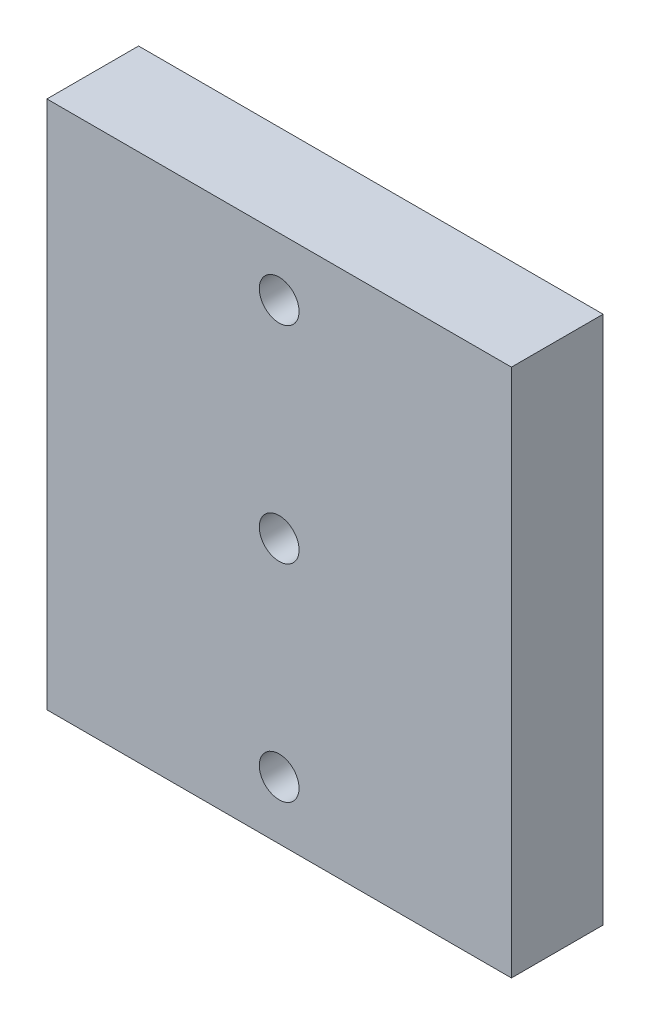
ISO-10303-21;
HEADER;
FILE_DESCRIPTION(('STEP AP214'),'2;1');
FILE_NAME('part.step','',(''),(''),'','','');
FILE_SCHEMA(('AUTOMOTIVE_DESIGN { 1 0 10303 214 1 1 1 1 }'));
ENDSEC;
DATA;
#1=APPLICATION_CONTEXT('core data for automotive mechanical design processes');
#2=APPLICATION_PROTOCOL_DEFINITION('international standard','automotive_design',2000,#1);
#3=PRODUCT_CONTEXT('',#1,'mechanical');
#4=PRODUCT('Part','Part','',(#3));
#5=PRODUCT_RELATED_PRODUCT_CATEGORY('part','',(#4));
#6=PRODUCT_DEFINITION_FORMATION('','',#4);
#7=PRODUCT_DEFINITION_CONTEXT('part definition',#1,'design');
#8=PRODUCT_DEFINITION('design','',#6,#7);
#9=PRODUCT_DEFINITION_SHAPE('','',#8);
#10=(LENGTH_UNIT() NAMED_UNIT(*) SI_UNIT(.MILLI.,.METRE.));
#11=(NAMED_UNIT(*) PLANE_ANGLE_UNIT() SI_UNIT($,.RADIAN.));
#12=(NAMED_UNIT(*) SI_UNIT($,.STERADIAN.) SOLID_ANGLE_UNIT());
#13=UNCERTAINTY_MEASURE_WITH_UNIT(LENGTH_MEASURE(1.E-05),#10,'distance_accuracy_value','');
#14=(GEOMETRIC_REPRESENTATION_CONTEXT(3) GLOBAL_UNCERTAINTY_ASSIGNED_CONTEXT((#13)) GLOBAL_UNIT_ASSIGNED_CONTEXT((#10,
#11,#12)) REPRESENTATION_CONTEXT('',''));
#15=CARTESIAN_POINT('',(0.,0.,0.));
#16=DIRECTION('',(0.,0.,1.));
#17=DIRECTION('',(1.,0.,0.));
#18=AXIS2_PLACEMENT_3D('',#15,#16,#17);
#19=CARTESIAN_POINT('',(0.,0.,0.));
#20=DIRECTION('',(0.,0.,1.));
#21=DIRECTION('',(1.,0.,0.));
#22=AXIS2_PLACEMENT_3D('',#19,#20,#21);
#23=CYLINDRICAL_SURFACE('',#22,6.5151);
#24=CARTESIAN_POINT('',(0.,0.,0.));
#25=DIRECTION('',(0.,0.,1.));
#26=DIRECTION('',(1.,0.,0.));
#27=AXIS2_PLACEMENT_3D('',#24,#25,#26);
#28=CIRCLE('',#27,6.5151);
#29=CARTESIAN_POINT('',(6.51509999999997,0.,0.));
#30=VERTEX_POINT('',#29);
#31=EDGE_CURVE('E152',#30,#30,#28,.T.);
#32=ORIENTED_EDGE('',*,*,#31,.F.);
#33=EDGE_LOOP('',(#32));
#34=FACE_BOUND('',#33,.T.);
#35=CARTESIAN_POINT('',(0.,0.,9.525));
#36=DIRECTION('',(0.,0.,1.));
#37=DIRECTION('',(1.,0.,0.));
#38=AXIS2_PLACEMENT_3D('',#35,#36,#37);
#39=CIRCLE('',#38,6.5151);
#40=CARTESIAN_POINT('',(6.51509999999997,0.,9.525));
#41=VERTEX_POINT('',#40);
#42=EDGE_CURVE('E58',#41,#41,#39,.F.);
#43=ORIENTED_EDGE('',*,*,#42,.F.);
#44=EDGE_LOOP('',(#43));
#45=FACE_BOUND('',#44,.T.);
#46=ADVANCED_FACE('F54',(#34,#45),#23,.F.);
#47=CARTESIAN_POINT('',(0.,-101.6,0.));
#48=DIRECTION('',(0.,0.,1.));
#49=DIRECTION('',(1.,0.,0.));
#50=AXIS2_PLACEMENT_3D('',#47,#48,#49);
#51=CYLINDRICAL_SURFACE('',#50,6.5151);
#52=CARTESIAN_POINT('',(0.,-101.6,0.));
#53=DIRECTION('',(0.,0.,1.));
#54=DIRECTION('',(1.,0.,0.));
#55=AXIS2_PLACEMENT_3D('',#52,#53,#54);
#56=CIRCLE('',#55,6.5151);
#57=CARTESIAN_POINT('',(6.51510000000002,-101.6,0.));
#58=VERTEX_POINT('',#57);
#59=EDGE_CURVE('E157',#58,#58,#56,.T.);
#60=ORIENTED_EDGE('',*,*,#59,.F.);
#61=EDGE_LOOP('',(#60));
#62=FACE_BOUND('',#61,.T.);
#63=CARTESIAN_POINT('',(0.,-101.6,9.525));
#64=DIRECTION('',(0.,0.,1.));
#65=DIRECTION('',(1.,0.,0.));
#66=AXIS2_PLACEMENT_3D('',#63,#64,#65);
#67=CIRCLE('',#66,6.5151);
#68=CARTESIAN_POINT('',(6.51510000000002,-101.6,9.525));
#69=VERTEX_POINT('',#68);
#70=EDGE_CURVE('E144',#69,#69,#67,.F.);
#71=ORIENTED_EDGE('',*,*,#70,.F.);
#72=EDGE_LOOP('',(#71));
#73=FACE_BOUND('',#72,.T.);
#74=ADVANCED_FACE('F204',(#62,#73),#51,.F.);
#75=CARTESIAN_POINT('',(0.,101.6,0.));
#76=DIRECTION('',(0.,0.,1.));
#77=DIRECTION('',(1.,0.,0.));
#78=AXIS2_PLACEMENT_3D('',#75,#76,#77);
#79=CYLINDRICAL_SURFACE('',#78,6.5151);
#80=CARTESIAN_POINT('',(0.,101.6,0.));
#81=DIRECTION('',(0.,0.,1.));
#82=DIRECTION('',(1.,0.,0.));
#83=AXIS2_PLACEMENT_3D('',#80,#81,#82);
#84=CIRCLE('',#83,6.5151);
#85=CARTESIAN_POINT('',(6.51510000000002,101.6,0.));
#86=VERTEX_POINT('',#85);
#87=EDGE_CURVE('E130',#86,#86,#84,.T.);
#88=ORIENTED_EDGE('',*,*,#87,.F.);
#89=EDGE_LOOP('',(#88));
#90=FACE_BOUND('',#89,.T.);
#91=CARTESIAN_POINT('',(0.,101.6,9.525));
#92=DIRECTION('',(0.,0.,1.));
#93=DIRECTION('',(1.,0.,0.));
#94=AXIS2_PLACEMENT_3D('',#91,#92,#93);
#95=CIRCLE('',#94,6.5151);
#96=CARTESIAN_POINT('',(6.51510000000002,101.6,9.525));
#97=VERTEX_POINT('',#96);
#98=EDGE_CURVE('E141',#97,#97,#95,.F.);
#99=ORIENTED_EDGE('',*,*,#98,.F.);
#100=EDGE_LOOP('',(#99));
#101=FACE_BOUND('',#100,.T.);
#102=ADVANCED_FACE('F201',(#90,#101),#79,.F.);
#103=CARTESIAN_POINT('',(114.3,130.175,45.1104));
#104=DIRECTION('',(-1.,0.,0.));
#105=DIRECTION('',(0.,-1.,0.));
#106=AXIS2_PLACEMENT_3D('',#103,#104,#105);
#107=PLANE('',#106);
#108=DIRECTION('',(0.,1.,0.));
#109=VECTOR('',#108,1.);
#110=CARTESIAN_POINT('',(114.3,130.175,0.));
#111=LINE('',#110,#109);
#112=CARTESIAN_POINT('',(114.3,-130.175,0.));
#113=VERTEX_POINT('',#112);
#114=CARTESIAN_POINT('',(114.3,130.175,0.));
#115=VERTEX_POINT('',#114);
#116=EDGE_CURVE('E126',#113,#115,#111,.T.);
#117=ORIENTED_EDGE('',*,*,#116,.T.);
#118=DIRECTION('',(0.,0.,-1.));
#119=VECTOR('',#118,1.);
#120=CARTESIAN_POINT('',(114.3,130.175,45.1104));
#121=LINE('',#120,#119);
#122=CARTESIAN_POINT('',(114.3,130.175,45.1104));
#123=VERTEX_POINT('',#122);
#124=EDGE_CURVE('E13',#123,#115,#121,.T.);
#125=ORIENTED_EDGE('',*,*,#124,.F.);
#126=DIRECTION('',(0.,1.,0.));
#127=VECTOR('',#126,1.);
#128=CARTESIAN_POINT('',(114.3,130.175,45.1104));
#129=LINE('',#128,#127);
#130=CARTESIAN_POINT('',(114.3,-130.175,45.1104));
#131=VERTEX_POINT('',#130);
#132=EDGE_CURVE('E109',#131,#123,#129,.T.);
#133=ORIENTED_EDGE('',*,*,#132,.F.);
#134=DIRECTION('',(0.,0.,-1.));
#135=VECTOR('',#134,1.);
#136=CARTESIAN_POINT('',(114.3,-130.175,45.1104));
#137=LINE('',#136,#135);
#138=EDGE_CURVE('E122',#131,#113,#137,.T.);
#139=ORIENTED_EDGE('',*,*,#138,.T.);
#140=EDGE_LOOP('',(#117,#125,#133,#139));
#141=FACE_BOUND('',#140,.T.);
#142=ADVANCED_FACE('F56',(#141),#107,.F.);
#143=CARTESIAN_POINT('',(-114.3,130.175,45.1104));
#144=DIRECTION('',(0.,-1.,0.));
#145=DIRECTION('',(0.,0.,-1.));
#146=AXIS2_PLACEMENT_3D('',#143,#144,#145);
#147=PLANE('',#146);
#148=DIRECTION('',(-1.,0.,0.));
#149=VECTOR('',#148,1.);
#150=CARTESIAN_POINT('',(-114.3,130.175,0.));
#151=LINE('',#150,#149);
#152=CARTESIAN_POINT('',(-114.3,130.175,0.));
#153=VERTEX_POINT('',#152);
#154=EDGE_CURVE('E114',#115,#153,#151,.T.);
#155=ORIENTED_EDGE('',*,*,#154,.T.);
#156=DIRECTION('',(0.,0.,-1.));
#157=VECTOR('',#156,1.);
#158=CARTESIAN_POINT('',(-114.3,130.175,45.1104));
#159=LINE('',#158,#157);
#160=CARTESIAN_POINT('',(-114.3,130.175,45.1104));
#161=VERTEX_POINT('',#160);
#162=EDGE_CURVE('E65',#161,#153,#159,.T.);
#163=ORIENTED_EDGE('',*,*,#162,.F.);
#164=DIRECTION('',(-1.,0.,0.));
#165=VECTOR('',#164,1.);
#166=CARTESIAN_POINT('',(-114.3,130.175,45.1104));
#167=LINE('',#166,#165);
#168=EDGE_CURVE('E104',#123,#161,#167,.T.);
#169=ORIENTED_EDGE('',*,*,#168,.F.);
#170=ORIENTED_EDGE('',*,*,#124,.T.);
#171=EDGE_LOOP('',(#155,#163,#169,#170));
#172=FACE_BOUND('',#171,.T.);
#173=ADVANCED_FACE('F113',(#172),#147,.F.);
#174=CARTESIAN_POINT('',(-114.3,130.175,45.1104));
#175=DIRECTION('',(1.,0.,0.));
#176=DIRECTION('',(0.,1.,0.));
#177=AXIS2_PLACEMENT_3D('',#174,#175,#176);
#178=PLANE('',#177);
#179=DIRECTION('',(0.,-1.,0.));
#180=VECTOR('',#179,1.);
#181=CARTESIAN_POINT('',(-114.3,130.175,0.));
#182=LINE('',#181,#180);
#183=CARTESIAN_POINT('',(-114.3,-130.175,0.));
#184=VERTEX_POINT('',#183);
#185=EDGE_CURVE('E91',#153,#184,#182,.T.);
#186=ORIENTED_EDGE('',*,*,#185,.T.);
#187=DIRECTION('',(0.,0.,-1.));
#188=VECTOR('',#187,1.);
#189=CARTESIAN_POINT('',(-114.3,-130.175,45.1104));
#190=LINE('',#189,#188);
#191=CARTESIAN_POINT('',(-114.3,-130.175,45.1104));
#192=VERTEX_POINT('',#191);
#193=EDGE_CURVE('E116',#192,#184,#190,.T.);
#194=ORIENTED_EDGE('',*,*,#193,.F.);
#195=DIRECTION('',(0.,-1.,0.));
#196=VECTOR('',#195,1.);
#197=CARTESIAN_POINT('',(-114.3,130.175,45.1104));
#198=LINE('',#197,#196);
#199=EDGE_CURVE('E107',#161,#192,#198,.T.);
#200=ORIENTED_EDGE('',*,*,#199,.F.);
#201=ORIENTED_EDGE('',*,*,#162,.T.);
#202=EDGE_LOOP('',(#186,#194,#200,#201));
#203=FACE_BOUND('',#202,.T.);
#204=ADVANCED_FACE('F118',(#203),#178,.F.);
#205=CARTESIAN_POINT('',(-114.3,-130.175,45.1104));
#206=DIRECTION('',(0.,1.,0.));
#207=DIRECTION('',(0.,0.,1.));
#208=AXIS2_PLACEMENT_3D('',#205,#206,#207);
#209=PLANE('',#208);
#210=DIRECTION('',(1.,0.,0.));
#211=VECTOR('',#210,1.);
#212=CARTESIAN_POINT('',(-114.3,-130.175,0.));
#213=LINE('',#212,#211);
#214=EDGE_CURVE('E97',#184,#113,#213,.T.);
#215=ORIENTED_EDGE('',*,*,#214,.T.);
#216=ORIENTED_EDGE('',*,*,#138,.F.);
#217=DIRECTION('',(1.,0.,0.));
#218=VECTOR('',#217,1.);
#219=CARTESIAN_POINT('',(-114.3,-130.175,45.1104));
#220=LINE('',#219,#218);
#221=EDGE_CURVE('E74',#192,#131,#220,.T.);
#222=ORIENTED_EDGE('',*,*,#221,.F.);
#223=ORIENTED_EDGE('',*,*,#193,.T.);
#224=EDGE_LOOP('',(#215,#216,#222,#223));
#225=FACE_BOUND('',#224,.T.);
#226=ADVANCED_FACE('F234',(#225),#209,.F.);
#227=CARTESIAN_POINT('',(0.,0.,45.1104));
#228=DIRECTION('',(0.,0.,1.));
#229=DIRECTION('',(1.,0.,0.));
#230=AXIS2_PLACEMENT_3D('',#227,#228,#229);
#231=PLANE('',#230);
#232=CARTESIAN_POINT('',(0.,101.6,45.1104));
#233=DIRECTION('',(0.,0.,1.));
#234=DIRECTION('',(1.,0.,0.));
#235=AXIS2_PLACEMENT_3D('',#232,#233,#234);
#236=CIRCLE('',#235,9.77899999999999);
#237=CARTESIAN_POINT('',(9.77900000000002,101.6,45.1104));
#238=VERTEX_POINT('',#237);
#239=EDGE_CURVE('E171',#238,#238,#236,.T.);
#240=ORIENTED_EDGE('',*,*,#239,.F.);
#241=EDGE_LOOP('',(#240));
#242=FACE_BOUND('',#241,.T.);
#243=CARTESIAN_POINT('',(0.,0.,45.1104));
#244=DIRECTION('',(0.,0.,1.));
#245=DIRECTION('',(1.,0.,0.));
#246=AXIS2_PLACEMENT_3D('',#243,#244,#245);
#247=CIRCLE('',#246,9.779);
#248=CARTESIAN_POINT('',(9.77899999999997,0.,45.1104));
#249=VERTEX_POINT('',#248);
#250=EDGE_CURVE('E176',#249,#249,#247,.T.);
#251=ORIENTED_EDGE('',*,*,#250,.F.);
#252=EDGE_LOOP('',(#251));
#253=FACE_BOUND('',#252,.T.);
#254=CARTESIAN_POINT('',(0.,-101.6,45.1104));
#255=DIRECTION('',(0.,0.,1.));
#256=DIRECTION('',(1.,0.,0.));
#257=AXIS2_PLACEMENT_3D('',#254,#255,#256);
#258=CIRCLE('',#257,9.77899999999999);
#259=CARTESIAN_POINT('',(9.77900000000002,-101.6,45.1104));
#260=VERTEX_POINT('',#259);
#261=EDGE_CURVE('E183',#260,#260,#258,.T.);
#262=ORIENTED_EDGE('',*,*,#261,.F.);
#263=EDGE_LOOP('',(#262));
#264=FACE_BOUND('',#263,.T.);
#265=ORIENTED_EDGE('',*,*,#132,.T.);
#266=ORIENTED_EDGE('',*,*,#168,.T.);
#267=ORIENTED_EDGE('',*,*,#199,.T.);
#268=ORIENTED_EDGE('',*,*,#221,.T.);
#269=EDGE_LOOP('',(#265,#266,#267,#268));
#270=FACE_BOUND('',#269,.T.);
#271=ADVANCED_FACE('F105',(#242,#253,#264,#270),#231,.T.);
#272=CARTESIAN_POINT('',(0.,0.,0.));
#273=DIRECTION('',(0.,0.,1.));
#274=DIRECTION('',(1.,0.,0.));
#275=AXIS2_PLACEMENT_3D('',#272,#273,#274);
#276=PLANE('',#275);
#277=ORIENTED_EDGE('',*,*,#87,.T.);
#278=EDGE_LOOP('',(#277));
#279=FACE_BOUND('',#278,.T.);
#280=ORIENTED_EDGE('',*,*,#59,.T.);
#281=EDGE_LOOP('',(#280));
#282=FACE_BOUND('',#281,.T.);
#283=ORIENTED_EDGE('',*,*,#31,.T.);
#284=EDGE_LOOP('',(#283));
#285=FACE_BOUND('',#284,.T.);
#286=ORIENTED_EDGE('',*,*,#116,.F.);
#287=ORIENTED_EDGE('',*,*,#214,.F.);
#288=ORIENTED_EDGE('',*,*,#185,.F.);
#289=ORIENTED_EDGE('',*,*,#154,.F.);
#290=EDGE_LOOP('',(#286,#287,#288,#289));
#291=FACE_BOUND('',#290,.T.);
#292=ADVANCED_FACE('F198',(#279,#282,#285,#291),#276,.F.);
#293=CARTESIAN_POINT('',(0.,0.,9.525));
#294=DIRECTION('',(0.,0.,1.));
#295=DIRECTION('',(1.,0.,0.));
#296=AXIS2_PLACEMENT_3D('',#293,#294,#295);
#297=PLANE('',#296);
#298=CARTESIAN_POINT('',(0.,101.6,9.525));
#299=DIRECTION('',(0.,0.,1.));
#300=DIRECTION('',(1.,0.,0.));
#301=AXIS2_PLACEMENT_3D('',#298,#299,#300);
#302=CIRCLE('',#301,9.77899999999999);
#303=CARTESIAN_POINT('',(9.77900000000002,101.6,9.525));
#304=VERTEX_POINT('',#303);
#305=EDGE_CURVE('E145',#304,#304,#302,.F.);
#306=ORIENTED_EDGE('',*,*,#305,.F.);
#307=EDGE_LOOP('',(#306));
#308=FACE_BOUND('',#307,.T.);
#309=ORIENTED_EDGE('',*,*,#98,.T.);
#310=EDGE_LOOP('',(#309));
#311=FACE_BOUND('',#310,.T.);
#312=ADVANCED_FACE('F208',(#308,#311),#297,.T.);
#313=CARTESIAN_POINT('',(0.,101.6,-27.659188852893));
#314=DIRECTION('',(0.,0.,1.));
#315=DIRECTION('',(1.,0.,0.));
#316=AXIS2_PLACEMENT_3D('',#313,#314,#315);
#317=CYLINDRICAL_SURFACE('',#316,9.77899999999999);
#318=ORIENTED_EDGE('',*,*,#305,.T.);
#319=EDGE_LOOP('',(#318));
#320=FACE_BOUND('',#319,.T.);
#321=ORIENTED_EDGE('',*,*,#239,.T.);
#322=EDGE_LOOP('',(#321));
#323=FACE_BOUND('',#322,.T.);
#324=ADVANCED_FACE('F210',(#320,#323),#317,.F.);
#325=CARTESIAN_POINT('',(0.,0.,9.525));
#326=DIRECTION('',(0.,0.,1.));
#327=DIRECTION('',(1.,0.,0.));
#328=AXIS2_PLACEMENT_3D('',#325,#326,#327);
#329=PLANE('',#328);
#330=CARTESIAN_POINT('',(0.,-101.6,9.525));
#331=DIRECTION('',(0.,0.,1.));
#332=DIRECTION('',(1.,0.,0.));
#333=AXIS2_PLACEMENT_3D('',#330,#331,#332);
#334=CIRCLE('',#333,9.77899999999999);
#335=CARTESIAN_POINT('',(9.77900000000002,-101.6,9.525));
#336=VERTEX_POINT('',#335);
#337=EDGE_CURVE('E188',#336,#336,#334,.F.);
#338=ORIENTED_EDGE('',*,*,#337,.F.);
#339=EDGE_LOOP('',(#338));
#340=FACE_BOUND('',#339,.T.);
#341=ORIENTED_EDGE('',*,*,#70,.T.);
#342=EDGE_LOOP('',(#341));
#343=FACE_BOUND('',#342,.T.);
#344=ADVANCED_FACE('F218',(#340,#343),#329,.T.);
#345=CARTESIAN_POINT('',(0.,-101.6,-27.659188852893));
#346=DIRECTION('',(0.,0.,1.));
#347=DIRECTION('',(1.,0.,0.));
#348=AXIS2_PLACEMENT_3D('',#345,#346,#347);
#349=CYLINDRICAL_SURFACE('',#348,9.77899999999999);
#350=ORIENTED_EDGE('',*,*,#337,.T.);
#351=EDGE_LOOP('',(#350));
#352=FACE_BOUND('',#351,.T.);
#353=ORIENTED_EDGE('',*,*,#261,.T.);
#354=EDGE_LOOP('',(#353));
#355=FACE_BOUND('',#354,.T.);
#356=ADVANCED_FACE('F314',(#352,#355),#349,.F.);
#357=CARTESIAN_POINT('',(0.,0.,9.525));
#358=DIRECTION('',(0.,0.,1.));
#359=DIRECTION('',(1.,0.,0.));
#360=AXIS2_PLACEMENT_3D('',#357,#358,#359);
#361=PLANE('',#360);
#362=CARTESIAN_POINT('',(0.,0.,9.525));
#363=DIRECTION('',(0.,0.,1.));
#364=DIRECTION('',(1.,0.,0.));
#365=AXIS2_PLACEMENT_3D('',#362,#363,#364);
#366=CIRCLE('',#365,9.779);
#367=CARTESIAN_POINT('',(9.77899999999997,0.,9.525));
#368=VERTEX_POINT('',#367);
#369=EDGE_CURVE('E180',#368,#368,#366,.F.);
#370=ORIENTED_EDGE('',*,*,#369,.F.);
#371=EDGE_LOOP('',(#370));
#372=FACE_BOUND('',#371,.T.);
#373=ORIENTED_EDGE('',*,*,#42,.T.);
#374=EDGE_LOOP('',(#373));
#375=FACE_BOUND('',#374,.T.);
#376=ADVANCED_FACE('F325',(#372,#375),#361,.T.);
#377=CARTESIAN_POINT('',(0.,0.,-27.659188852893));
#378=DIRECTION('',(0.,0.,1.));
#379=DIRECTION('',(1.,0.,0.));
#380=AXIS2_PLACEMENT_3D('',#377,#378,#379);
#381=CYLINDRICAL_SURFACE('',#380,9.779);
#382=ORIENTED_EDGE('',*,*,#369,.T.);
#383=EDGE_LOOP('',(#382));
#384=FACE_BOUND('',#383,.T.);
#385=ORIENTED_EDGE('',*,*,#250,.T.);
#386=EDGE_LOOP('',(#385));
#387=FACE_BOUND('',#386,.T.);
#388=ADVANCED_FACE('F335',(#384,#387),#381,.F.);
#389=CLOSED_SHELL('',(#46,#74,#102,#142,#173,#204,#226,#271,#292,#312,#324,#344,#356,#376,#388));
#390=MANIFOLD_SOLID_BREP('B2',#389);
#391=ADVANCED_BREP_SHAPE_REPRESENTATION('',(#18,#390),#14);
#392=SHAPE_DEFINITION_REPRESENTATION(#9,#391);
ENDSEC;
END-ISO-10303-21;
